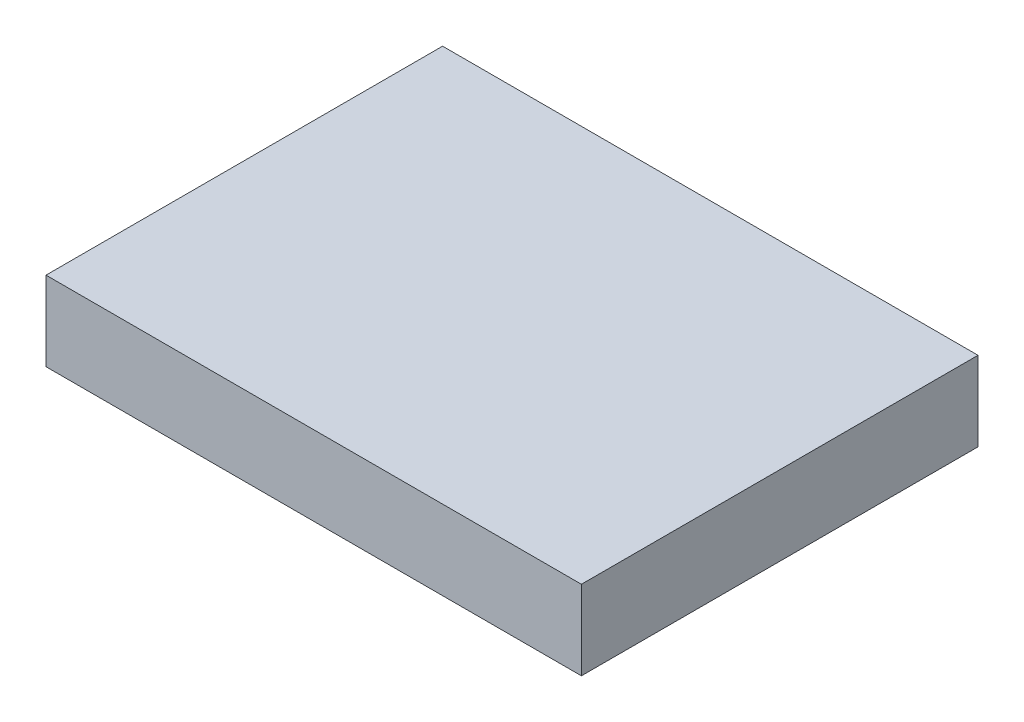
ISO-10303-21;
HEADER;
FILE_DESCRIPTION(('STEP AP214'),'2;1');
FILE_NAME('part.step','',(''),(''),'','','');
FILE_SCHEMA(('AUTOMOTIVE_DESIGN { 1 0 10303 214 1 1 1 1 }'));
ENDSEC;
DATA;
#1=APPLICATION_CONTEXT('core data for automotive mechanical design processes');
#2=APPLICATION_PROTOCOL_DEFINITION('international standard','automotive_design',2000,#1);
#3=PRODUCT_CONTEXT('',#1,'mechanical');
#4=PRODUCT('Part','Part','',(#3));
#5=PRODUCT_RELATED_PRODUCT_CATEGORY('part','',(#4));
#6=PRODUCT_DEFINITION_FORMATION('','',#4);
#7=PRODUCT_DEFINITION_CONTEXT('part definition',#1,'design');
#8=PRODUCT_DEFINITION('design','',#6,#7);
#9=PRODUCT_DEFINITION_SHAPE('','',#8);
#10=(LENGTH_UNIT() NAMED_UNIT(*) SI_UNIT(.MILLI.,.METRE.));
#11=(NAMED_UNIT(*) PLANE_ANGLE_UNIT() SI_UNIT($,.RADIAN.));
#12=(NAMED_UNIT(*) SI_UNIT($,.STERADIAN.) SOLID_ANGLE_UNIT());
#13=UNCERTAINTY_MEASURE_WITH_UNIT(LENGTH_MEASURE(1.E-05),#10,'distance_accuracy_value','');
#14=(GEOMETRIC_REPRESENTATION_CONTEXT(3) GLOBAL_UNCERTAINTY_ASSIGNED_CONTEXT((#13)) GLOBAL_UNIT_ASSIGNED_CONTEXT((#10,
#11,#12)) REPRESENTATION_CONTEXT('',''));
#15=CARTESIAN_POINT('',(0.,0.,0.));
#16=DIRECTION('',(0.,0.,1.));
#17=DIRECTION('',(1.,0.,0.));
#18=AXIS2_PLACEMENT_3D('',#15,#16,#17);
#19=CARTESIAN_POINT('',(0.,4.,0.));
#20=DIRECTION('',(-1.,0.,0.));
#21=DIRECTION('',(0.,0.,1.));
#22=AXIS2_PLACEMENT_3D('',#19,#20,#21);
#23=PLANE('',#22);
#24=DIRECTION('',(0.,0.,-1.));
#25=VECTOR('',#24,1.);
#26=CARTESIAN_POINT('',(0.,0.,0.));
#27=LINE('',#26,#25);
#28=CARTESIAN_POINT('',(0.,0.,0.));
#29=VERTEX_POINT('',#28);
#30=CARTESIAN_POINT('',(0.,0.,-20.));
#31=VERTEX_POINT('',#30);
#32=EDGE_CURVE('E98',#29,#31,#27,.T.);
#33=ORIENTED_EDGE('',*,*,#32,.F.);
#34=DIRECTION('',(0.,-1.,0.));
#35=VECTOR('',#34,1.);
#36=CARTESIAN_POINT('',(0.,4.,0.));
#37=LINE('',#36,#35);
#38=CARTESIAN_POINT('',(0.,4.,0.));
#39=VERTEX_POINT('',#38);
#40=EDGE_CURVE('E11',#39,#29,#37,.T.);
#41=ORIENTED_EDGE('',*,*,#40,.F.);
#42=DIRECTION('',(0.,0.,-1.));
#43=VECTOR('',#42,1.);
#44=CARTESIAN_POINT('',(0.,4.,0.));
#45=LINE('',#44,#43);
#46=CARTESIAN_POINT('',(0.,4.,-20.));
#47=VERTEX_POINT('',#46);
#48=EDGE_CURVE('E93',#39,#47,#45,.T.);
#49=ORIENTED_EDGE('',*,*,#48,.T.);
#50=DIRECTION('',(0.,-1.,0.));
#51=VECTOR('',#50,1.);
#52=CARTESIAN_POINT('',(0.,4.,-20.));
#53=LINE('',#52,#51);
#54=EDGE_CURVE('E36',#47,#31,#53,.T.);
#55=ORIENTED_EDGE('',*,*,#54,.T.);
#56=EDGE_LOOP('',(#33,#41,#49,#55));
#57=FACE_BOUND('',#56,.T.);
#58=ADVANCED_FACE('F33',(#57),#23,.T.);
#59=CARTESIAN_POINT('',(0.,4.,0.));
#60=DIRECTION('',(0.,0.,-1.));
#61=DIRECTION('',(-1.,0.,0.));
#62=AXIS2_PLACEMENT_3D('',#59,#60,#61);
#63=PLANE('',#62);
#64=DIRECTION('',(1.,0.,0.));
#65=VECTOR('',#64,1.);
#66=CARTESIAN_POINT('',(0.,0.,0.));
#67=LINE('',#66,#65);
#68=CARTESIAN_POINT('',(27.,0.,0.));
#69=VERTEX_POINT('',#68);
#70=EDGE_CURVE('E66',#29,#69,#67,.T.);
#71=ORIENTED_EDGE('',*,*,#70,.T.);
#72=DIRECTION('',(0.,-1.,0.));
#73=VECTOR('',#72,1.);
#74=CARTESIAN_POINT('',(27.,4.,0.));
#75=LINE('',#74,#73);
#76=CARTESIAN_POINT('',(27.,4.,0.));
#77=VERTEX_POINT('',#76);
#78=EDGE_CURVE('E42',#77,#69,#75,.T.);
#79=ORIENTED_EDGE('',*,*,#78,.F.);
#80=DIRECTION('',(1.,0.,0.));
#81=VECTOR('',#80,1.);
#82=CARTESIAN_POINT('',(0.,4.,0.));
#83=LINE('',#82,#81);
#84=EDGE_CURVE('E83',#39,#77,#83,.T.);
#85=ORIENTED_EDGE('',*,*,#84,.F.);
#86=ORIENTED_EDGE('',*,*,#40,.T.);
#87=EDGE_LOOP('',(#71,#79,#85,#86));
#88=FACE_BOUND('',#87,.T.);
#89=ADVANCED_FACE('F108',(#88),#63,.F.);
#90=CARTESIAN_POINT('',(27.,4.,0.));
#91=DIRECTION('',(-1.,0.,0.));
#92=DIRECTION('',(0.,0.,1.));
#93=AXIS2_PLACEMENT_3D('',#90,#91,#92);
#94=PLANE('',#93);
#95=DIRECTION('',(0.,0.,-1.));
#96=VECTOR('',#95,1.);
#97=CARTESIAN_POINT('',(27.,0.,0.));
#98=LINE('',#97,#96);
#99=CARTESIAN_POINT('',(27.,0.,-20.));
#100=VERTEX_POINT('',#99);
#101=EDGE_CURVE('E90',#69,#100,#98,.T.);
#102=ORIENTED_EDGE('',*,*,#101,.T.);
#103=DIRECTION('',(0.,-1.,0.));
#104=VECTOR('',#103,1.);
#105=CARTESIAN_POINT('',(27.,4.,-20.));
#106=LINE('',#105,#104);
#107=CARTESIAN_POINT('',(27.,4.,-20.));
#108=VERTEX_POINT('',#107);
#109=EDGE_CURVE('E87',#108,#100,#106,.T.);
#110=ORIENTED_EDGE('',*,*,#109,.F.);
#111=DIRECTION('',(0.,0.,-1.));
#112=VECTOR('',#111,1.);
#113=CARTESIAN_POINT('',(27.,4.,0.));
#114=LINE('',#113,#112);
#115=EDGE_CURVE('E78',#77,#108,#114,.T.);
#116=ORIENTED_EDGE('',*,*,#115,.F.);
#117=ORIENTED_EDGE('',*,*,#78,.T.);
#118=EDGE_LOOP('',(#102,#110,#116,#117));
#119=FACE_BOUND('',#118,.T.);
#120=ADVANCED_FACE('F88',(#119),#94,.F.);
#121=CARTESIAN_POINT('',(0.,4.,-20.));
#122=DIRECTION('',(0.,0.,-1.));
#123=DIRECTION('',(-1.,0.,0.));
#124=AXIS2_PLACEMENT_3D('',#121,#122,#123);
#125=PLANE('',#124);
#126=DIRECTION('',(1.,0.,0.));
#127=VECTOR('',#126,1.);
#128=CARTESIAN_POINT('',(0.,0.,-20.));
#129=LINE('',#128,#127);
#130=EDGE_CURVE('E101',#31,#100,#129,.T.);
#131=ORIENTED_EDGE('',*,*,#130,.F.);
#132=ORIENTED_EDGE('',*,*,#54,.F.);
#133=DIRECTION('',(1.,0.,0.));
#134=VECTOR('',#133,1.);
#135=CARTESIAN_POINT('',(0.,4.,-20.));
#136=LINE('',#135,#134);
#137=EDGE_CURVE('E82',#47,#108,#136,.T.);
#138=ORIENTED_EDGE('',*,*,#137,.T.);
#139=ORIENTED_EDGE('',*,*,#109,.T.);
#140=EDGE_LOOP('',(#131,#132,#138,#139));
#141=FACE_BOUND('',#140,.T.);
#142=ADVANCED_FACE('F92',(#141),#125,.T.);
#143=CARTESIAN_POINT('',(0.,4.,0.));
#144=DIRECTION('',(0.,-1.,0.));
#145=DIRECTION('',(0.,0.,-1.));
#146=AXIS2_PLACEMENT_3D('',#143,#144,#145);
#147=PLANE('',#146);
#148=ORIENTED_EDGE('',*,*,#48,.F.);
#149=ORIENTED_EDGE('',*,*,#84,.T.);
#150=ORIENTED_EDGE('',*,*,#115,.T.);
#151=ORIENTED_EDGE('',*,*,#137,.F.);
#152=EDGE_LOOP('',(#148,#149,#150,#151));
#153=FACE_BOUND('',#152,.T.);
#154=ADVANCED_FACE('F81',(#153),#147,.F.);
#155=CARTESIAN_POINT('',(0.,0.,0.));
#156=DIRECTION('',(0.,-1.,0.));
#157=DIRECTION('',(0.,0.,-1.));
#158=AXIS2_PLACEMENT_3D('',#155,#156,#157);
#159=PLANE('',#158);
#160=ORIENTED_EDGE('',*,*,#32,.T.);
#161=ORIENTED_EDGE('',*,*,#130,.T.);
#162=ORIENTED_EDGE('',*,*,#101,.F.);
#163=ORIENTED_EDGE('',*,*,#70,.F.);
#164=EDGE_LOOP('',(#160,#161,#162,#163));
#165=FACE_BOUND('',#164,.T.);
#166=ADVANCED_FACE('F106',(#165),#159,.T.);
#167=CLOSED_SHELL('',(#58,#89,#120,#142,#154,#166));
#168=MANIFOLD_SOLID_BREP('B2',#167);
#169=ADVANCED_BREP_SHAPE_REPRESENTATION('',(#18,#168),#14);
#170=SHAPE_DEFINITION_REPRESENTATION(#9,#169);
ENDSEC;
END-ISO-10303-21;
